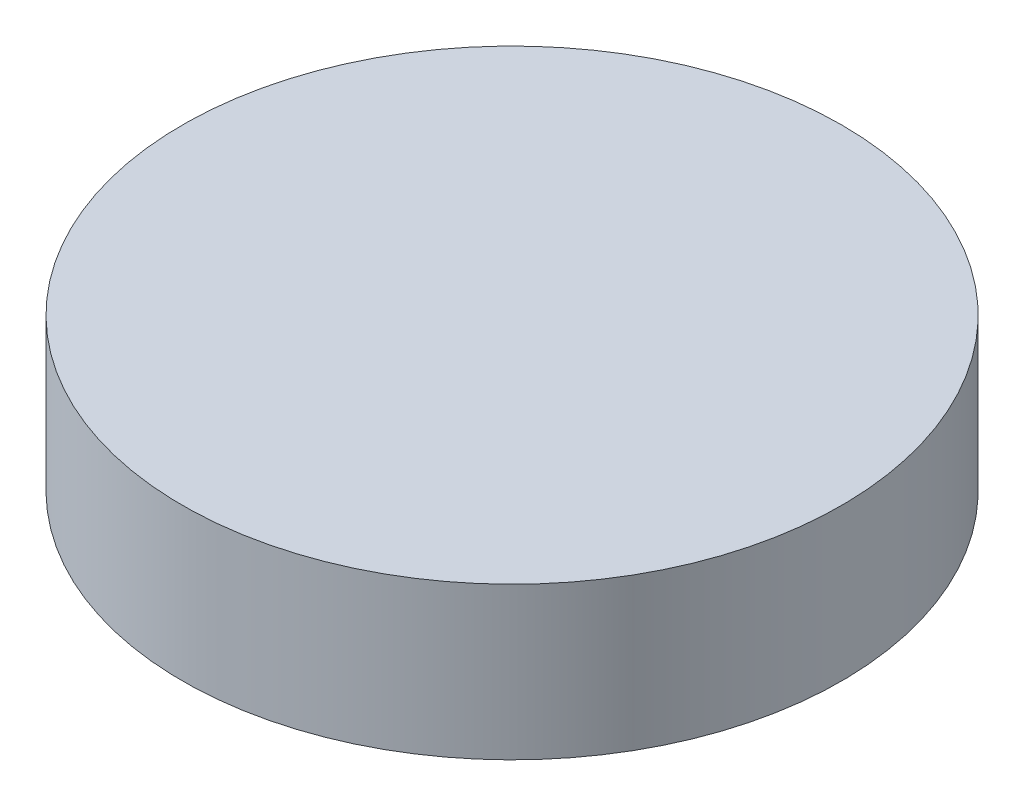
ISO-10303-21;
HEADER;
FILE_DESCRIPTION(('STEP AP214'),'2;1');
FILE_NAME('part.step','',(''),(''),'','','');
FILE_SCHEMA(('AUTOMOTIVE_DESIGN { 1 0 10303 214 1 1 1 1 }'));
ENDSEC;
DATA;
#1=APPLICATION_CONTEXT('core data for automotive mechanical design processes');
#2=APPLICATION_PROTOCOL_DEFINITION('international standard','automotive_design',2000,#1);
#3=PRODUCT_CONTEXT('',#1,'mechanical');
#4=PRODUCT('Part','Part','',(#3));
#5=PRODUCT_RELATED_PRODUCT_CATEGORY('part','',(#4));
#6=PRODUCT_DEFINITION_FORMATION('','',#4);
#7=PRODUCT_DEFINITION_CONTEXT('part definition',#1,'design');
#8=PRODUCT_DEFINITION('design','',#6,#7);
#9=PRODUCT_DEFINITION_SHAPE('','',#8);
#10=(LENGTH_UNIT() NAMED_UNIT(*) SI_UNIT(.MILLI.,.METRE.));
#11=(NAMED_UNIT(*) PLANE_ANGLE_UNIT() SI_UNIT($,.RADIAN.));
#12=(NAMED_UNIT(*) SI_UNIT($,.STERADIAN.) SOLID_ANGLE_UNIT());
#13=UNCERTAINTY_MEASURE_WITH_UNIT(LENGTH_MEASURE(1.E-05),#10,'distance_accuracy_value','');
#14=(GEOMETRIC_REPRESENTATION_CONTEXT(3) GLOBAL_UNCERTAINTY_ASSIGNED_CONTEXT((#13)) GLOBAL_UNIT_ASSIGNED_CONTEXT((#10,
#11,#12)) REPRESENTATION_CONTEXT('',''));
#15=CARTESIAN_POINT('',(0.,0.,0.));
#16=DIRECTION('',(0.,0.,1.));
#17=DIRECTION('',(1.,0.,0.));
#18=AXIS2_PLACEMENT_3D('',#15,#16,#17);
#19=CARTESIAN_POINT('',(0.,7.62,0.));
#20=DIRECTION('',(0.,-1.,0.));
#21=DIRECTION('',(0.,0.,-1.));
#22=AXIS2_PLACEMENT_3D('',#19,#20,#21);
#23=CYLINDRICAL_SURFACE('',#22,16.51);
#24=CARTESIAN_POINT('',(0.,7.62,0.));
#25=DIRECTION('',(0.,1.,0.));
#26=DIRECTION('',(0.,0.,1.));
#27=AXIS2_PLACEMENT_3D('',#24,#25,#26);
#28=CIRCLE('',#27,16.51);
#29=CARTESIAN_POINT('',(0.,7.62,-16.51));
#30=VERTEX_POINT('',#29);
#31=EDGE_CURVE('E10',#30,#30,#28,.T.);
#32=CARTESIAN_POINT('',(0.,0.,0.));
#33=DIRECTION('',(0.,1.,0.));
#34=DIRECTION('',(0.,0.,1.));
#35=AXIS2_PLACEMENT_3D('',#32,#33,#34);
#36=CIRCLE('',#35,16.51);
#37=CARTESIAN_POINT('',(0.,0.,-16.51));
#38=VERTEX_POINT('',#37);
#39=EDGE_CURVE('E40',#38,#38,#36,.T.);
#40=CARTESIAN_POINT('',(0.,7.62,-16.51));
#41=CARTESIAN_POINT('',(0.,7.540625,-16.51));
#42=CARTESIAN_POINT('',(0.,7.46125,-16.51));
#43=CARTESIAN_POINT('',(0.,7.3025,-16.51));
#44=CARTESIAN_POINT('',(0.,7.223125,-16.51));
#45=CARTESIAN_POINT('',(0.,7.064375,-16.51));
#46=CARTESIAN_POINT('',(0.,6.985,-16.51));
#47=CARTESIAN_POINT('',(0.,6.82625,-16.51));
#48=CARTESIAN_POINT('',(0.,6.746875,-16.51));
#49=CARTESIAN_POINT('',(0.,6.588125,-16.51));
#50=CARTESIAN_POINT('',(0.,6.50875,-16.51));
#51=CARTESIAN_POINT('',(0.,6.35,-16.51));
#52=CARTESIAN_POINT('',(0.,6.270625,-16.51));
#53=CARTESIAN_POINT('',(0.,6.111875,-16.51));
#54=CARTESIAN_POINT('',(0.,6.0325,-16.51));
#55=CARTESIAN_POINT('',(0.,5.87375,-16.51));
#56=CARTESIAN_POINT('',(0.,5.794375,-16.51));
#57=CARTESIAN_POINT('',(0.,5.635625,-16.51));
#58=CARTESIAN_POINT('',(0.,5.55625,-16.51));
#59=CARTESIAN_POINT('',(0.,5.3975,-16.51));
#60=CARTESIAN_POINT('',(0.,5.318125,-16.51));
#61=CARTESIAN_POINT('',(0.,5.159375,-16.51));
#62=CARTESIAN_POINT('',(0.,5.08,-16.51));
#63=CARTESIAN_POINT('',(0.,4.92125,-16.51));
#64=CARTESIAN_POINT('',(0.,4.841875,-16.51));
#65=CARTESIAN_POINT('',(0.,4.683125,-16.51));
#66=CARTESIAN_POINT('',(0.,4.60375,-16.51));
#67=CARTESIAN_POINT('',(0.,4.445,-16.51));
#68=CARTESIAN_POINT('',(0.,4.365625,-16.51));
#69=CARTESIAN_POINT('',(0.,4.206875,-16.51));
#70=CARTESIAN_POINT('',(0.,4.1275,-16.51));
#71=CARTESIAN_POINT('',(0.,3.96875,-16.51));
#72=CARTESIAN_POINT('',(0.,3.889375,-16.51));
#73=CARTESIAN_POINT('',(0.,3.730625,-16.51));
#74=CARTESIAN_POINT('',(0.,3.65125,-16.51));
#75=CARTESIAN_POINT('',(0.,3.4925,-16.51));
#76=CARTESIAN_POINT('',(0.,3.413125,-16.51));
#77=CARTESIAN_POINT('',(0.,3.254375,-16.51));
#78=CARTESIAN_POINT('',(0.,3.175,-16.51));
#79=CARTESIAN_POINT('',(0.,3.01625,-16.51));
#80=CARTESIAN_POINT('',(0.,2.936875,-16.51));
#81=CARTESIAN_POINT('',(0.,2.778125,-16.51));
#82=CARTESIAN_POINT('',(0.,2.69875,-16.51));
#83=CARTESIAN_POINT('',(0.,2.54,-16.51));
#84=CARTESIAN_POINT('',(0.,2.460625,-16.51));
#85=CARTESIAN_POINT('',(0.,2.301875,-16.51));
#86=CARTESIAN_POINT('',(0.,2.2225,-16.51));
#87=CARTESIAN_POINT('',(0.,2.06375,-16.51));
#88=CARTESIAN_POINT('',(0.,1.984375,-16.51));
#89=CARTESIAN_POINT('',(0.,1.825625,-16.51));
#90=CARTESIAN_POINT('',(0.,1.74625,-16.51));
#91=CARTESIAN_POINT('',(0.,1.5875,-16.51));
#92=CARTESIAN_POINT('',(0.,1.508125,-16.51));
#93=CARTESIAN_POINT('',(0.,1.349375,-16.51));
#94=CARTESIAN_POINT('',(0.,1.27,-16.51));
#95=CARTESIAN_POINT('',(0.,1.11125,-16.51));
#96=CARTESIAN_POINT('',(0.,1.031875,-16.51));
#97=CARTESIAN_POINT('',(0.,0.873125,-16.51));
#98=CARTESIAN_POINT('',(0.,0.79375,-16.51));
#99=CARTESIAN_POINT('',(0.,0.635,-16.51));
#100=CARTESIAN_POINT('',(0.,0.555625,-16.51));
#101=CARTESIAN_POINT('',(0.,0.396875,-16.51));
#102=CARTESIAN_POINT('',(0.,0.3175,-16.51));
#103=CARTESIAN_POINT('',(0.,0.15875,-16.51));
#104=CARTESIAN_POINT('',(0.,0.0793749999999999,-16.51));
#105=CARTESIAN_POINT('',(0.,0.,-16.51));
#106=B_SPLINE_CURVE_WITH_KNOTS('',3,(#40,#41,#42,#43,#44,#45,#46,#47,#48,#49,#50,#51,#52,#53,
#54,#55,#56,#57,#58,#59,#60,#61,#62,#63,#64,#65,#66,#67,#68,#69,#70,#71,#72,#73,#74,#75,#76,#77,
#78,#79,#80,#81,#82,#83,#84,#85,#86,#87,#88,#89,#90,#91,#92,#93,#94,#95,#96,#97,#98,#99,#100,
#101,#102,#103,#104,#105),.UNSPECIFIED.,.F.,.F.,(4,2,2,2,2,2,2,2,2,2,2,2,2,2,2,2,2,2,2,2,2,2,2,
2,2,2,2,2,2,2,2,2,4),(0.,0.238125,0.476249999999999,0.714375,0.952499999999999,1.190625,1.42875,
1.666875,1.905,2.143125,2.38125,2.619375,2.8575,3.095625,3.33375,3.571875,3.81,4.048125,4.28625,
4.524375,4.7625,5.000625,5.23875,5.476875,5.715,5.953125,6.19125,6.429375,6.6675,6.905625,
7.14375,7.381875,7.62),.UNSPECIFIED.);
#107=EDGE_CURVE('BSEAM37',#30,#38,#106,.T.);
#108=ORIENTED_EDGE('',*,*,#31,.F.);
#109=ORIENTED_EDGE('',*,*,#39,.T.);
#110=ORIENTED_EDGE('',*,*,#107,.T.);
#111=ORIENTED_EDGE('',*,*,#107,.F.);
#112=EDGE_LOOP('',(#108,#110,#109,#111));
#113=FACE_BOUND('',#112,.T.);
#114=ADVANCED_FACE('F37',(#113),#23,.T.);
#115=CARTESIAN_POINT('',(0.,7.62,0.));
#116=DIRECTION('',(0.,1.,0.));
#117=DIRECTION('',(0.,0.,1.));
#118=AXIS2_PLACEMENT_3D('',#115,#116,#117);
#119=PLANE('',#118);
#120=ORIENTED_EDGE('',*,*,#31,.T.);
#121=EDGE_LOOP('',(#120));
#122=FACE_BOUND('',#121,.T.);
#123=ADVANCED_FACE('F54',(#122),#119,.T.);
#124=CARTESIAN_POINT('',(0.,0.,0.));
#125=DIRECTION('',(0.,1.,0.));
#126=DIRECTION('',(0.,0.,1.));
#127=AXIS2_PLACEMENT_3D('',#124,#125,#126);
#128=PLANE('',#127);
#129=ORIENTED_EDGE('',*,*,#39,.F.);
#130=EDGE_LOOP('',(#129));
#131=FACE_BOUND('',#130,.T.);
#132=ADVANCED_FACE('F52',(#131),#128,.F.);
#133=CLOSED_SHELL('',(#114,#123,#132));
#134=MANIFOLD_SOLID_BREP('B2',#133);
#135=ADVANCED_BREP_SHAPE_REPRESENTATION('',(#18,#134),#14);
#136=SHAPE_DEFINITION_REPRESENTATION(#9,#135);
ENDSEC;
END-ISO-10303-21;
